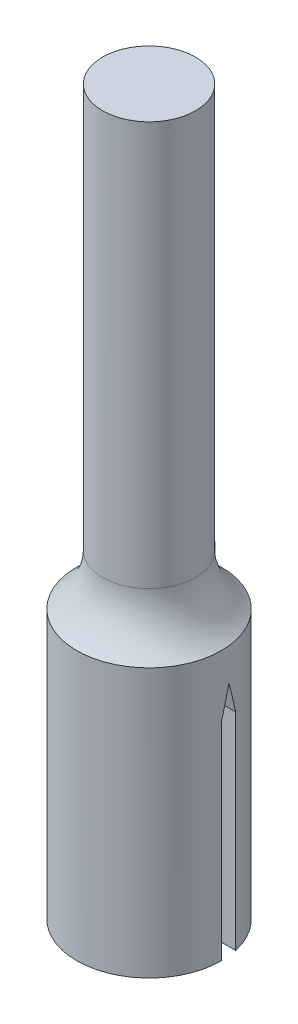
ISO-10303-21;
HEADER;
FILE_DESCRIPTION(('STEP AP214'),'2;1');
FILE_NAME('part.step','',(''),(''),'','','');
FILE_SCHEMA(('AUTOMOTIVE_DESIGN { 1 0 10303 214 1 1 1 1 }'));
ENDSEC;
DATA;
#1=APPLICATION_CONTEXT('core data for automotive mechanical design processes');
#2=APPLICATION_PROTOCOL_DEFINITION('international standard','automotive_design',2000,#1);
#3=PRODUCT_CONTEXT('',#1,'mechanical');
#4=PRODUCT('Part','Part','',(#3));
#5=PRODUCT_RELATED_PRODUCT_CATEGORY('part','',(#4));
#6=PRODUCT_DEFINITION_FORMATION('','',#4);
#7=PRODUCT_DEFINITION_CONTEXT('part definition',#1,'design');
#8=PRODUCT_DEFINITION('design','',#6,#7);
#9=PRODUCT_DEFINITION_SHAPE('','',#8);
#10=(LENGTH_UNIT() NAMED_UNIT(*) SI_UNIT(.MILLI.,.METRE.));
#11=(NAMED_UNIT(*) PLANE_ANGLE_UNIT() SI_UNIT($,.RADIAN.));
#12=(NAMED_UNIT(*) SI_UNIT($,.STERADIAN.) SOLID_ANGLE_UNIT());
#13=UNCERTAINTY_MEASURE_WITH_UNIT(LENGTH_MEASURE(1.E-05),#10,'distance_accuracy_value','');
#14=(GEOMETRIC_REPRESENTATION_CONTEXT(3) GLOBAL_UNCERTAINTY_ASSIGNED_CONTEXT((#13)) GLOBAL_UNIT_ASSIGNED_CONTEXT((#10,
#11,#12)) REPRESENTATION_CONTEXT('',''));
#15=CARTESIAN_POINT('',(0.,0.,0.));
#16=DIRECTION('',(0.,0.,1.));
#17=DIRECTION('',(1.,0.,0.));
#18=AXIS2_PLACEMENT_3D('',#15,#16,#17);
#19=CARTESIAN_POINT('',(0.,-13.,0.));
#20=DIRECTION('',(0.,-1.,0.));
#21=DIRECTION('',(0.,0.,-1.));
#22=AXIS2_PLACEMENT_3D('',#19,#20,#21);
#23=PLANE('',#22);
#24=DIRECTION('',(1.,0.,0.));
#25=VECTOR('',#24,1.);
#26=CARTESIAN_POINT('',(0.,-13.,-0.777358438345921));
#27=LINE('',#26,#25);
#28=CARTESIAN_POINT('',(-3.41258169987656,-13.,-0.777358438345921));
#29=VERTEX_POINT('',#28);
#30=CARTESIAN_POINT('',(-1.28285379460498,-13.,-0.777358438345921));
#31=VERTEX_POINT('',#30);
#32=EDGE_CURVE('E168',#29,#31,#27,.T.);
#33=ORIENTED_EDGE('',*,*,#32,.F.);
#34=CARTESIAN_POINT('',(0.,-13.,0.));
#35=DIRECTION('',(0.,-1.,0.));
#36=DIRECTION('',(0.,0.,-1.));
#37=AXIS2_PLACEMENT_3D('',#34,#35,#36);
#38=CIRCLE('',#37,3.5);
#39=CARTESIAN_POINT('',(3.41258169987656,-13.,-0.777358438345921));
#40=VERTEX_POINT('',#39);
#41=EDGE_CURVE('E206',#29,#40,#38,.T.);
#42=ORIENTED_EDGE('',*,*,#41,.T.);
#43=CARTESIAN_POINT('',(1.28285379460498,-13.,-0.777358438345921));
#44=VERTEX_POINT('',#43);
#45=EDGE_CURVE('E175',#44,#40,#27,.T.);
#46=ORIENTED_EDGE('',*,*,#45,.F.);
#47=CARTESIAN_POINT('',(0.,-13.,0.));
#48=DIRECTION('',(0.,-1.,0.));
#49=DIRECTION('',(0.,0.,-1.));
#50=AXIS2_PLACEMENT_3D('',#47,#48,#49);
#51=CIRCLE('',#50,1.5);
#52=EDGE_CURVE('E201',#31,#44,#51,.T.);
#53=ORIENTED_EDGE('',*,*,#52,.F.);
#54=EDGE_LOOP('',(#33,#42,#46,#53));
#55=FACE_BOUND('',#54,.T.);
#56=ADVANCED_FACE('F33',(#55),#23,.T.);
#57=CARTESIAN_POINT('',(0.,-3.,0.));
#58=DIRECTION('',(0.,-1.,0.));
#59=DIRECTION('',(0.,0.,-1.));
#60=AXIS2_PLACEMENT_3D('',#57,#58,#59);
#61=CYLINDRICAL_SURFACE('',#60,1.5);
#62=ORIENTED_EDGE('',*,*,#52,.T.);
#63=DIRECTION('',(0.,-1.,0.));
#64=VECTOR('',#63,1.);
#65=CARTESIAN_POINT('',(1.28285379460498,-3.,-0.777358438345921));
#66=LINE('',#65,#64);
#67=CARTESIAN_POINT('',(1.28285379460498,-3.,-0.777358438345921));
#68=VERTEX_POINT('',#67);
#69=EDGE_CURVE('E184',#44,#68,#66,.F.);
#70=ORIENTED_EDGE('',*,*,#69,.T.);
#71=CARTESIAN_POINT('',(0.,-3.,0.));
#72=DIRECTION('',(0.,-1.,0.));
#73=DIRECTION('',(0.,0.,-1.));
#74=AXIS2_PLACEMENT_3D('',#71,#72,#73);
#75=CIRCLE('',#74,1.5);
#76=CARTESIAN_POINT('',(-1.28285379460498,-3.,-0.777358438345921));
#77=VERTEX_POINT('',#76);
#78=EDGE_CURVE('E197',#77,#68,#75,.T.);
#79=ORIENTED_EDGE('',*,*,#78,.F.);
#80=DIRECTION('',(0.,-1.,0.));
#81=VECTOR('',#80,1.);
#82=CARTESIAN_POINT('',(-1.28285379460498,-3.,-0.777358438345921));
#83=LINE('',#82,#81);
#84=EDGE_CURVE('E181',#77,#31,#83,.T.);
#85=ORIENTED_EDGE('',*,*,#84,.T.);
#86=EDGE_LOOP('',(#62,#70,#79,#85));
#87=FACE_BOUND('',#86,.T.);
#88=ADVANCED_FACE('F246',(#87),#61,.F.);
#89=CARTESIAN_POINT('',(0.,22.,0.));
#90=DIRECTION('',(0.,-1.,0.));
#91=DIRECTION('',(0.,0.,-1.));
#92=AXIS2_PLACEMENT_3D('',#89,#90,#91);
#93=CYLINDRICAL_SURFACE('',#92,2.25);
#94=CARTESIAN_POINT('',(0.,2.43669858620224,0.));
#95=DIRECTION('',(0.,-1.,0.));
#96=DIRECTION('',(0.,0.,-1.));
#97=AXIS2_PLACEMENT_3D('',#94,#95,#96);
#98=CIRCLE('',#97,2.25);
#99=CARTESIAN_POINT('',(0.,2.43669858620224,-2.25));
#100=VERTEX_POINT('',#99);
#101=EDGE_CURVE('E41',#100,#100,#98,.F.);
#102=ORIENTED_EDGE('',*,*,#101,.T.);
#103=EDGE_LOOP('',(#102));
#104=FACE_BOUND('',#103,.T.);
#105=CARTESIAN_POINT('',(0.,22.,0.));
#106=DIRECTION('',(0.,1.,0.));
#107=DIRECTION('',(0.,0.,1.));
#108=AXIS2_PLACEMENT_3D('',#105,#106,#107);
#109=CIRCLE('',#108,2.25);
#110=CARTESIAN_POINT('',(0.,22.,2.25));
#111=VERTEX_POINT('',#110);
#112=EDGE_CURVE('E213',#111,#111,#109,.T.);
#113=ORIENTED_EDGE('',*,*,#112,.F.);
#114=EDGE_LOOP('',(#113));
#115=FACE_BOUND('',#114,.T.);
#116=ADVANCED_FACE('F224',(#104,#115),#93,.T.);
#117=CARTESIAN_POINT('',(0.,22.,0.));
#118=DIRECTION('',(0.,1.,0.));
#119=DIRECTION('',(0.,0.,1.));
#120=AXIS2_PLACEMENT_3D('',#117,#118,#119);
#121=PLANE('',#120);
#122=ORIENTED_EDGE('',*,*,#112,.T.);
#123=EDGE_LOOP('',(#122));
#124=FACE_BOUND('',#123,.T.);
#125=ADVANCED_FACE('F234',(#124),#121,.T.);
#126=CARTESIAN_POINT('',(0.,-13.,0.));
#127=DIRECTION('',(0.,1.,0.));
#128=DIRECTION('',(0.,0.,1.));
#129=AXIS2_PLACEMENT_3D('',#126,#127,#128);
#130=CYLINDRICAL_SURFACE('',#129,3.5);
#131=DIRECTION('',(0.,1.,0.));
#132=VECTOR('',#131,1.);
#133=CARTESIAN_POINT('',(3.5,-13.,0.));
#134=LINE('',#133,#132);
#135=CARTESIAN_POINT('',(3.5,-13.,0.));
#136=VERTEX_POINT('',#135);
#137=CARTESIAN_POINT('',(3.5,-3.,0.));
#138=VERTEX_POINT('',#137);
#139=EDGE_CURVE('E152',#136,#138,#134,.T.);
#140=ORIENTED_EDGE('',*,*,#139,.T.);
#141=CARTESIAN_POINT('',(0.,-3.,0.));
#142=DIRECTION('',(0.,0.258819045102521,0.965925826289068));
#143=DIRECTION('',(0.,0.965925826289068,-0.258819045102521));
#144=AXIS2_PLACEMENT_3D('',#141,#142,#143);
#145=ELLIPSE('',#144,13.522961568047,3.5);
#146=CARTESIAN_POINT('',(3.47837489222674,-1.5502142182335,-0.388468929422458));
#147=VERTEX_POINT('',#146);
#148=EDGE_CURVE('E141',#138,#147,#145,.T.);
#149=ORIENTED_EDGE('',*,*,#148,.T.);
#150=CARTESIAN_POINT('',(0.,-0.100428436466991,0.));
#151=DIRECTION('',(0.,0.258819045102521,-0.965925826289068));
#152=DIRECTION('',(0.,0.965925826289068,0.258819045102521));
#153=AXIS2_PLACEMENT_3D('',#150,#151,#152);
#154=ELLIPSE('',#153,13.522961568047,3.5);
#155=CARTESIAN_POINT('',(3.41267747721543,-3.,-0.776937858844917));
#156=VERTEX_POINT('',#155);
#157=EDGE_CURVE('E127',#147,#156,#154,.T.);
#158=ORIENTED_EDGE('',*,*,#157,.T.);
#159=CARTESIAN_POINT('',(0.,-3.,0.));
#160=DIRECTION('',(0.,1.,0.));
#161=DIRECTION('',(0.,0.,1.));
#162=AXIS2_PLACEMENT_3D('',#159,#160,#161);
#163=CIRCLE('',#162,3.5);
#164=CARTESIAN_POINT('',(3.41258169987656,-3.,-0.777358438345921));
#165=VERTEX_POINT('',#164);
#166=EDGE_CURVE('E180',#156,#165,#163,.T.);
#167=ORIENTED_EDGE('',*,*,#166,.T.);
#168=DIRECTION('',(0.,1.,0.));
#169=VECTOR('',#168,1.);
#170=CARTESIAN_POINT('',(3.41258169987656,-13.,-0.777358438345921));
#171=LINE('',#170,#169);
#172=EDGE_CURVE('E187',#165,#40,#171,.F.);
#173=ORIENTED_EDGE('',*,*,#172,.T.);
#174=ORIENTED_EDGE('',*,*,#41,.F.);
#175=DIRECTION('',(0.,1.,0.));
#176=VECTOR('',#175,1.);
#177=CARTESIAN_POINT('',(-3.41258169987656,-13.,-0.777358438345921));
#178=LINE('',#177,#176);
#179=CARTESIAN_POINT('',(-3.41258169987656,-3.,-0.777358438345921));
#180=VERTEX_POINT('',#179);
#181=EDGE_CURVE('E190',#29,#180,#178,.T.);
#182=ORIENTED_EDGE('',*,*,#181,.T.);
#183=CARTESIAN_POINT('',(-3.41267747721543,-3.,-0.776937858844917));
#184=VERTEX_POINT('',#183);
#185=EDGE_CURVE('E177',#180,#184,#163,.T.);
#186=ORIENTED_EDGE('',*,*,#185,.T.);
#187=CARTESIAN_POINT('',(-3.47837489222674,-1.5502142182335,-0.388468929422458));
#188=VERTEX_POINT('',#187);
#189=EDGE_CURVE('E48',#184,#188,#154,.T.);
#190=ORIENTED_EDGE('',*,*,#189,.T.);
#191=CARTESIAN_POINT('',(-3.5,-3.,0.));
#192=VERTEX_POINT('',#191);
#193=EDGE_CURVE('E153',#188,#192,#145,.T.);
#194=ORIENTED_EDGE('',*,*,#193,.T.);
#195=DIRECTION('',(0.,1.,0.));
#196=VECTOR('',#195,1.);
#197=CARTESIAN_POINT('',(-3.5,-13.,0.));
#198=LINE('',#197,#196);
#199=CARTESIAN_POINT('',(-3.5,-13.,0.));
#200=VERTEX_POINT('',#199);
#201=EDGE_CURVE('E193',#192,#200,#198,.F.);
#202=ORIENTED_EDGE('',*,*,#201,.T.);
#203=EDGE_CURVE('E209',#136,#200,#38,.T.);
#204=ORIENTED_EDGE('',*,*,#203,.F.);
#205=EDGE_LOOP('',(#140,#149,#158,#167,#173,#174,#182,#186,#190,#194,#202,#204));
#206=FACE_BOUND('',#205,.T.);
#207=CARTESIAN_POINT('',(0.,0.,0.));
#208=DIRECTION('',(0.,-1.,0.));
#209=DIRECTION('',(0.,0.,-1.));
#210=AXIS2_PLACEMENT_3D('',#207,#208,#209);
#211=CIRCLE('',#210,3.5);
#212=CARTESIAN_POINT('',(0.,0.,-3.5));
#213=VERTEX_POINT('',#212);
#214=EDGE_CURVE('E210',#213,#213,#211,.T.);
#215=ORIENTED_EDGE('',*,*,#214,.T.);
#216=EDGE_LOOP('',(#215));
#217=FACE_BOUND('',#216,.T.);
#218=ADVANCED_FACE('F149',(#206,#217),#130,.T.);
#219=DIRECTION('',(-1.,0.,0.));
#220=VECTOR('',#219,1.);
#221=CARTESIAN_POINT('',(0.,-13.,0.));
#222=LINE('',#221,#220);
#223=CARTESIAN_POINT('',(1.5,-13.,0.));
#224=VERTEX_POINT('',#223);
#225=EDGE_CURVE('E174',#136,#224,#222,.T.);
#226=ORIENTED_EDGE('',*,*,#225,.F.);
#227=ORIENTED_EDGE('',*,*,#203,.T.);
#228=CARTESIAN_POINT('',(-1.5,-13.,0.));
#229=VERTEX_POINT('',#228);
#230=EDGE_CURVE('E156',#229,#200,#222,.T.);
#231=ORIENTED_EDGE('',*,*,#230,.F.);
#232=EDGE_CURVE('E205',#224,#229,#51,.T.);
#233=ORIENTED_EDGE('',*,*,#232,.F.);
#234=EDGE_LOOP('',(#226,#227,#231,#233));
#235=FACE_BOUND('',#234,.T.);
#236=ADVANCED_FACE('F233',(#235),#23,.T.);
#237=ORIENTED_EDGE('',*,*,#232,.T.);
#238=DIRECTION('',(0.,-1.,0.));
#239=VECTOR('',#238,1.);
#240=CARTESIAN_POINT('',(-1.5,-3.,0.));
#241=LINE('',#240,#239);
#242=CARTESIAN_POINT('',(-1.5,-3.,0.));
#243=VERTEX_POINT('',#242);
#244=EDGE_CURVE('E219',#229,#243,#241,.F.);
#245=ORIENTED_EDGE('',*,*,#244,.T.);
#246=CARTESIAN_POINT('',(1.5,-3.,0.));
#247=VERTEX_POINT('',#246);
#248=EDGE_CURVE('E202',#247,#243,#75,.T.);
#249=ORIENTED_EDGE('',*,*,#248,.F.);
#250=DIRECTION('',(0.,-1.,0.));
#251=VECTOR('',#250,1.);
#252=CARTESIAN_POINT('',(1.5,-3.,0.));
#253=LINE('',#252,#251);
#254=EDGE_CURVE('E216',#247,#224,#253,.T.);
#255=ORIENTED_EDGE('',*,*,#254,.T.);
#256=EDGE_LOOP('',(#237,#245,#249,#255));
#257=FACE_BOUND('',#256,.T.);
#258=ADVANCED_FACE('F240',(#257),#61,.F.);
#259=CARTESIAN_POINT('',(0.,-3.,0.));
#260=DIRECTION('',(0.,-1.,0.));
#261=DIRECTION('',(0.,0.,-1.));
#262=AXIS2_PLACEMENT_3D('',#259,#260,#261);
#263=CONICAL_SURFACE('',#262,1.5,0.383972435438753);
#264=CARTESIAN_POINT('',(0.,0.712630280124443,0.));
#265=VERTEX_POINT('',#264);
#266=VERTEX_LOOP('',#265);
#267=FACE_BOUND('',#266,.T.);
#268=ORIENTED_EDGE('',*,*,#248,.T.);
#269=CARTESIAN_POINT('',(-1.50008080428793,-3.0002,5.35898384862549E-05));
#270=CARTESIAN_POINT('',(-1.47514087641807,-2.9384737439364,-0.0164859106255527));
#271=CARTESIAN_POINT('',(-1.44996709505696,-2.8768362636587,-0.0330016236894519));
#272=CARTESIAN_POINT('',(-1.39906897991784,-2.75376910695188,-0.0659773689438374));
#273=CARTESIAN_POINT('',(-1.37334460942295,-2.69233944469976,-0.0824373973356108));
#274=CARTESIAN_POINT('',(-1.29527830134689,-2.50854220064302,-0.131685720451678));
#275=CARTESIAN_POINT('',(-1.2419937512904,-2.38654312252083,-0.164375274911863));
#276=CARTESIAN_POINT('',(-1.15939866018489,-2.20462247933334,-0.2131207643405));
#277=CARTESIAN_POINT('',(-1.1314116318653,-2.14414021721333,-0.229326937631963));
#278=CARTESIAN_POINT('',(-1.07435711973586,-2.02365755363553,-0.261610170039586));
#279=CARTESIAN_POINT('',(-1.04528972061655,-1.963657114854,-0.27768723915661));
#280=CARTESIAN_POINT('',(-0.985802745983916,-1.84420979824995,-0.309693051178731));
#281=CARTESIAN_POINT('',(-0.955381907493651,-1.78476350285137,-0.325621638023802));
#282=CARTESIAN_POINT('',(-0.892822545983478,-1.66670212718013,-0.357256088292219));
#283=CARTESIAN_POINT('',(-0.860683557464457,-1.60808727766997,-0.372961889882937));
#284=CARTESIAN_POINT('',(-0.827497955873711,-1.5500142182335,-0.388522519260945));
#285=B_SPLINE_CURVE_WITH_KNOTS('',3,(#269,#270,#271,#272,#273,#274,#275,#276,#277,#278,#279,
#280,#281,#282,#283,#284),.UNSPECIFIED.,.F.,.F.,(4,2,2,2,2,2,2,4),(0.,0.205791938006397,
0.411597642585609,0.822798635185781,1.02854822291553,1.23428171576068,1.44021139194853,
1.64619714632671),.UNSPECIFIED.);
#286=CARTESIAN_POINT('',(-0.827612379948429,-1.5502142182335,-0.388468929422458));
#287=VERTEX_POINT('',#286);
#288=EDGE_CURVE('E137',#243,#287,#285,.T.);
#289=ORIENTED_EDGE('',*,*,#288,.T.);
#290=CARTESIAN_POINT('',(-0.827548269845276,-1.5500142182335,-0.388415339583972));
#291=CARTESIAN_POINT('',(-0.860326702985182,-1.65229113857438,-0.415820357793655));
#292=CARTESIAN_POINT('',(-0.892922360657941,-1.75462243109896,-0.443239944986048));
#293=CARTESIAN_POINT('',(-0.957829388767956,-1.95936884186726,-0.498101580404584));
#294=CARTESIAN_POINT('',(-0.990140759961892,-2.06178395988707,-0.525543628570731));
#295=CARTESIAN_POINT('',(-1.08677020217729,-2.36911723054872,-0.607893330251736));
#296=CARTESIAN_POINT('',(-1.1507840034057,-2.5741245596597,-0.662824878529485));
#297=CARTESIAN_POINT('',(-1.23745341323372,-2.85286046305697,-0.737511938746342));
#298=CARTESIAN_POINT('',(-1.26032425632202,-2.92652671314104,-0.757250750965798));
#299=CARTESIAN_POINT('',(-1.28317056969754,-3.00020000000006,-0.776991448683419));
#300=B_SPLINE_CURVE_WITH_KNOTS('',3,(#290,#291,#292,#293,#294,#295,#296,#297,#298,#299),
.UNSPECIFIED.,.F.,.F.,(4,2,2,2,4),(0.,0.332526516521076,0.665052147694494,1.33009931588845,
1.56896053551084),.UNSPECIFIED.);
#301=CARTESIAN_POINT('',(-1.28310855483606,-3.,-0.776937858844917));
#302=VERTEX_POINT('',#301);
#303=EDGE_CURVE('E273',#287,#302,#300,.T.);
#304=ORIENTED_EDGE('',*,*,#303,.T.);
#305=EDGE_CURVE('E55',#302,#77,#75,.T.);
#306=ORIENTED_EDGE('',*,*,#305,.T.);
#307=ORIENTED_EDGE('',*,*,#78,.T.);
#308=CARTESIAN_POINT('',(1.28310855483606,-3.,-0.776937858844917));
#309=VERTEX_POINT('',#308);
#310=EDGE_CURVE('E198',#68,#309,#75,.T.);
#311=ORIENTED_EDGE('',*,*,#310,.T.);
#312=CARTESIAN_POINT('',(1.28317056969754,-3.00020000000006,-0.776991448683419));
#313=CARTESIAN_POINT('',(1.24565424867147,-2.87921898301369,-0.744574682882427));
#314=CARTESIAN_POINT('',(1.20807003705465,-2.7582575384799,-0.712163161504295));
#315=CARTESIAN_POINT('',(1.13270555449237,-2.51639231384416,-0.647355569885977));
#316=CARTESIAN_POINT('',(1.09492528451203,-2.39548853346155,-0.614959499570587));
#317=CARTESIAN_POINT('',(1.0191079203472,-2.15375558721433,-0.550187351839648));
#318=CARTESIAN_POINT('',(0.981070825357494,-2.03292642158496,-0.517811274487132));
#319=CARTESIAN_POINT('',(0.904620956773295,-1.79137842726321,-0.453088684475261));
#320=CARTESIAN_POINT('',(0.866208181293074,-1.670659599128,-0.420742171965199));
#321=CARTESIAN_POINT('',(0.827548269847446,-1.55001421823287,-0.388415339583804));
#322=B_SPLINE_CURVE_WITH_KNOTS('',3,(#312,#313,#314,#315,#316,#317,#318,#319,#320,#321),
.UNSPECIFIED.,.F.,.F.,(4,2,2,2,4),(0.,0.392240491894314,0.784479054774852,1.17671884803153,
1.56896061115182),.UNSPECIFIED.);
#323=CARTESIAN_POINT('',(0.827612379948429,-1.5502142182335,-0.388468929422458));
#324=VERTEX_POINT('',#323);
#325=EDGE_CURVE('E145',#309,#324,#322,.T.);
#326=ORIENTED_EDGE('',*,*,#325,.T.);
#327=CARTESIAN_POINT('',(0.827497955873711,-1.5500142182335,-0.388522519260945));
#328=CARTESIAN_POINT('',(0.854409496616017,-1.59708385752321,-0.375910247425241));
#329=CARTESIAN_POINT('',(0.880622271705589,-1.6445182564122,-0.36320023854948));
#330=CARTESIAN_POINT('',(0.93186762744714,-1.73996832168132,-0.337624470643121));
#331=CARTESIAN_POINT('',(0.956900422539483,-1.78798388043712,-0.324758740450375));
#332=CARTESIAN_POINT('',(1.00600006004323,-1.88444023791749,-0.298913337358663));
#333=CARTESIAN_POINT('',(1.03006739734031,-1.93288080285782,-0.285933727101995));
#334=CARTESIAN_POINT('',(1.07740230989558,-2.03012750711353,-0.259876551230091));
#335=CARTESIAN_POINT('',(1.10066984290561,-2.07893366557535,-0.24679898048458));
#336=CARTESIAN_POINT('',(1.16940645625366,-2.22567491983818,-0.207479779908525));
#337=CARTESIAN_POINT('',(1.21386841654901,-2.32405006712041,-0.181120238638958));
#338=CARTESIAN_POINT('',(1.30080332967138,-2.52162410126728,-0.128180435743945));
#339=CARTESIAN_POINT('',(1.34327605468001,-2.62082308095764,-0.101600149245922));
#340=CARTESIAN_POINT('',(1.40447325514883,-2.76684101581586,-0.0624747615202017));
#341=CARTESIAN_POINT('',(1.42380083629037,-2.81342525510667,-0.0499925522222096));
#342=CARTESIAN_POINT('',(1.46215757396169,-2.9067226925226,-0.0249935792107191));
#343=CARTESIAN_POINT('',(1.48118664926124,-2.95343592181709,-0.0124768071454115));
#344=CARTESIAN_POINT('',(1.50008080428793,-3.0002,5.35898384861738E-05));
#345=B_SPLINE_CURVE_WITH_KNOTS('',3,(#327,#328,#329,#330,#331,#332,#333,#334,#335,#336,#337,
#338,#339,#340,#341,#342,#343,#344),.UNSPECIFIED.,.F.,.F.,(4,2,2,2,2,2,2,2,4),(0.,
0.166985861147034,0.333941257655183,0.500809951187634,0.667687445741577,1.0010378004405,
1.33442623940511,1.49029417095863,1.6462038065949),.UNSPECIFIED.);
#346=EDGE_CURVE('E144',#324,#247,#345,.T.);
#347=ORIENTED_EDGE('',*,*,#346,.T.);
#348=EDGE_LOOP('',(#268,#289,#304,#306,#307,#311,#326,#347));
#349=FACE_BOUND('',#348,.T.);
#350=ADVANCED_FACE('F255',(#267,#349),#263,.F.);
#351=CARTESIAN_POINT('',(0.,-3.,0.));
#352=DIRECTION('',(0.,1.,0.));
#353=DIRECTION('',(0.,0.,1.));
#354=AXIS2_PLACEMENT_3D('',#351,#352,#353);
#355=PLANE('',#354);
#356=ORIENTED_EDGE('',*,*,#166,.F.);
#357=DIRECTION('',(1.,0.,0.));
#358=VECTOR('',#357,1.);
#359=CARTESIAN_POINT('',(0.,-3.,-0.776937858844917));
#360=LINE('',#359,#358);
#361=EDGE_CURVE('E133',#309,#156,#360,.T.);
#362=ORIENTED_EDGE('',*,*,#361,.F.);
#363=ORIENTED_EDGE('',*,*,#310,.F.);
#364=DIRECTION('',(1.,0.,0.));
#365=VECTOR('',#364,1.);
#366=CARTESIAN_POINT('',(-4.86210517120611,-3.,-0.777358438345921));
#367=LINE('',#366,#365);
#368=EDGE_CURVE('E169',#68,#165,#367,.T.);
#369=ORIENTED_EDGE('',*,*,#368,.T.);
#370=EDGE_LOOP('',(#356,#362,#363,#369));
#371=FACE_BOUND('',#370,.T.);
#372=ADVANCED_FACE('F260',(#371),#355,.F.);
#373=CARTESIAN_POINT('',(0.,-3.,0.));
#374=DIRECTION('',(0.,0.,1.));
#375=DIRECTION('',(1.,0.,0.));
#376=AXIS2_PLACEMENT_3D('',#373,#374,#375);
#377=PLANE('',#376);
#378=ORIENTED_EDGE('',*,*,#225,.T.);
#379=ORIENTED_EDGE('',*,*,#254,.F.);
#380=DIRECTION('',(-1.,0.,0.));
#381=VECTOR('',#380,1.);
#382=CARTESIAN_POINT('',(0.,-3.,0.));
#383=LINE('',#382,#381);
#384=EDGE_CURVE('E167',#138,#247,#383,.T.);
#385=ORIENTED_EDGE('',*,*,#384,.F.);
#386=ORIENTED_EDGE('',*,*,#139,.F.);
#387=EDGE_LOOP('',(#378,#379,#385,#386));
#388=FACE_BOUND('',#387,.T.);
#389=ADVANCED_FACE('F262',(#388),#377,.F.);
#390=CARTESIAN_POINT('',(0.,-3.,-0.777358438345921));
#391=DIRECTION('',(0.,0.,-1.));
#392=DIRECTION('',(-1.,0.,0.));
#393=AXIS2_PLACEMENT_3D('',#390,#391,#392);
#394=PLANE('',#393);
#395=ORIENTED_EDGE('',*,*,#368,.F.);
#396=ORIENTED_EDGE('',*,*,#69,.F.);
#397=ORIENTED_EDGE('',*,*,#45,.T.);
#398=ORIENTED_EDGE('',*,*,#172,.F.);
#399=EDGE_LOOP('',(#395,#396,#397,#398));
#400=FACE_BOUND('',#399,.T.);
#401=ADVANCED_FACE('F296',(#400),#394,.F.);
#402=EDGE_CURVE('E165',#243,#192,#383,.T.);
#403=ORIENTED_EDGE('',*,*,#402,.F.);
#404=ORIENTED_EDGE('',*,*,#244,.F.);
#405=ORIENTED_EDGE('',*,*,#230,.T.);
#406=ORIENTED_EDGE('',*,*,#201,.F.);
#407=EDGE_LOOP('',(#403,#404,#405,#406));
#408=FACE_BOUND('',#407,.T.);
#409=ADVANCED_FACE('F294',(#408),#377,.F.);
#410=ORIENTED_EDGE('',*,*,#32,.T.);
#411=ORIENTED_EDGE('',*,*,#84,.F.);
#412=EDGE_CURVE('E172',#180,#77,#367,.T.);
#413=ORIENTED_EDGE('',*,*,#412,.F.);
#414=ORIENTED_EDGE('',*,*,#181,.F.);
#415=EDGE_LOOP('',(#410,#411,#413,#414));
#416=FACE_BOUND('',#415,.T.);
#417=ADVANCED_FACE('F292',(#416),#394,.F.);
#418=ORIENTED_EDGE('',*,*,#305,.F.);
#419=DIRECTION('',(-1.,0.,0.));
#420=VECTOR('',#419,1.);
#421=CARTESIAN_POINT('',(0.,-3.,-0.776937858844917));
#422=LINE('',#421,#420);
#423=EDGE_CURVE('E11',#302,#184,#422,.T.);
#424=ORIENTED_EDGE('',*,*,#423,.T.);
#425=ORIENTED_EDGE('',*,*,#185,.F.);
#426=ORIENTED_EDGE('',*,*,#412,.T.);
#427=EDGE_LOOP('',(#418,#424,#425,#426));
#428=FACE_BOUND('',#427,.T.);
#429=ADVANCED_FACE('F230',(#428),#355,.F.);
#430=CARTESIAN_POINT('',(0.,2.43669858620224,0.));
#431=DIRECTION('',(0.,-1.,0.));
#432=DIRECTION('',(0.,0.,-1.));
#433=AXIS2_PLACEMENT_3D('',#430,#431,#432);
#434=TOROIDAL_SURFACE('',#433,5.25,3.);
#435=ORIENTED_EDGE('',*,*,#101,.F.);
#436=EDGE_LOOP('',(#435));
#437=FACE_BOUND('',#436,.T.);
#438=ORIENTED_EDGE('',*,*,#214,.F.);
#439=EDGE_LOOP('',(#438));
#440=FACE_BOUND('',#439,.T.);
#441=ADVANCED_FACE('F35',(#437,#440),#434,.F.);
#442=CARTESIAN_POINT('',(0.,-3.,-0.776937858844917));
#443=DIRECTION('',(0.,0.258819045102521,-0.965925826289068));
#444=DIRECTION('',(0.,0.965925826289068,0.258819045102521));
#445=AXIS2_PLACEMENT_3D('',#442,#443,#444);
#446=PLANE('',#445);
#447=ORIENTED_EDGE('',*,*,#423,.F.);
#448=ORIENTED_EDGE('',*,*,#303,.F.);
#449=DIRECTION('',(-1.,0.,0.));
#450=VECTOR('',#449,1.);
#451=CARTESIAN_POINT('',(0.,-1.5502142182335,-0.388468929422458));
#452=LINE('',#451,#450);
#453=EDGE_CURVE('E146',#287,#188,#452,.T.);
#454=ORIENTED_EDGE('',*,*,#453,.T.);
#455=ORIENTED_EDGE('',*,*,#189,.F.);
#456=EDGE_LOOP('',(#447,#448,#454,#455));
#457=FACE_BOUND('',#456,.T.);
#458=ADVANCED_FACE('F229',(#457),#446,.F.);
#459=CARTESIAN_POINT('',(0.,-3.,0.));
#460=DIRECTION('',(0.,0.258819045102521,0.965925826289068));
#461=DIRECTION('',(0.,-0.965925826289068,0.258819045102521));
#462=AXIS2_PLACEMENT_3D('',#459,#460,#461);
#463=PLANE('',#462);
#464=ORIENTED_EDGE('',*,*,#453,.F.);
#465=ORIENTED_EDGE('',*,*,#288,.F.);
#466=ORIENTED_EDGE('',*,*,#402,.T.);
#467=ORIENTED_EDGE('',*,*,#193,.F.);
#468=EDGE_LOOP('',(#464,#465,#466,#467));
#469=FACE_BOUND('',#468,.T.);
#470=ADVANCED_FACE('F281',(#469),#463,.F.);
#471=ORIENTED_EDGE('',*,*,#384,.T.);
#472=ORIENTED_EDGE('',*,*,#346,.F.);
#473=EDGE_CURVE('E130',#147,#324,#452,.T.);
#474=ORIENTED_EDGE('',*,*,#473,.F.);
#475=ORIENTED_EDGE('',*,*,#148,.F.);
#476=EDGE_LOOP('',(#471,#472,#474,#475));
#477=FACE_BOUND('',#476,.T.);
#478=ADVANCED_FACE('F140',(#477),#463,.F.);
#479=ORIENTED_EDGE('',*,*,#473,.T.);
#480=ORIENTED_EDGE('',*,*,#325,.F.);
#481=ORIENTED_EDGE('',*,*,#361,.T.);
#482=ORIENTED_EDGE('',*,*,#157,.F.);
#483=EDGE_LOOP('',(#479,#480,#481,#482));
#484=FACE_BOUND('',#483,.T.);
#485=ADVANCED_FACE('F129',(#484),#446,.F.);
#486=CLOSED_SHELL('',(#56,#88,#116,#125,#218,#236,#258,#350,#372,#389,#401,#409,#417,#429,#441,
#458,#470,#478,#485));
#487=MANIFOLD_SOLID_BREP('B2',#486);
#488=ADVANCED_BREP_SHAPE_REPRESENTATION('',(#18,#487),#14);
#489=SHAPE_DEFINITION_REPRESENTATION(#9,#488);
ENDSEC;
END-ISO-10303-21;
